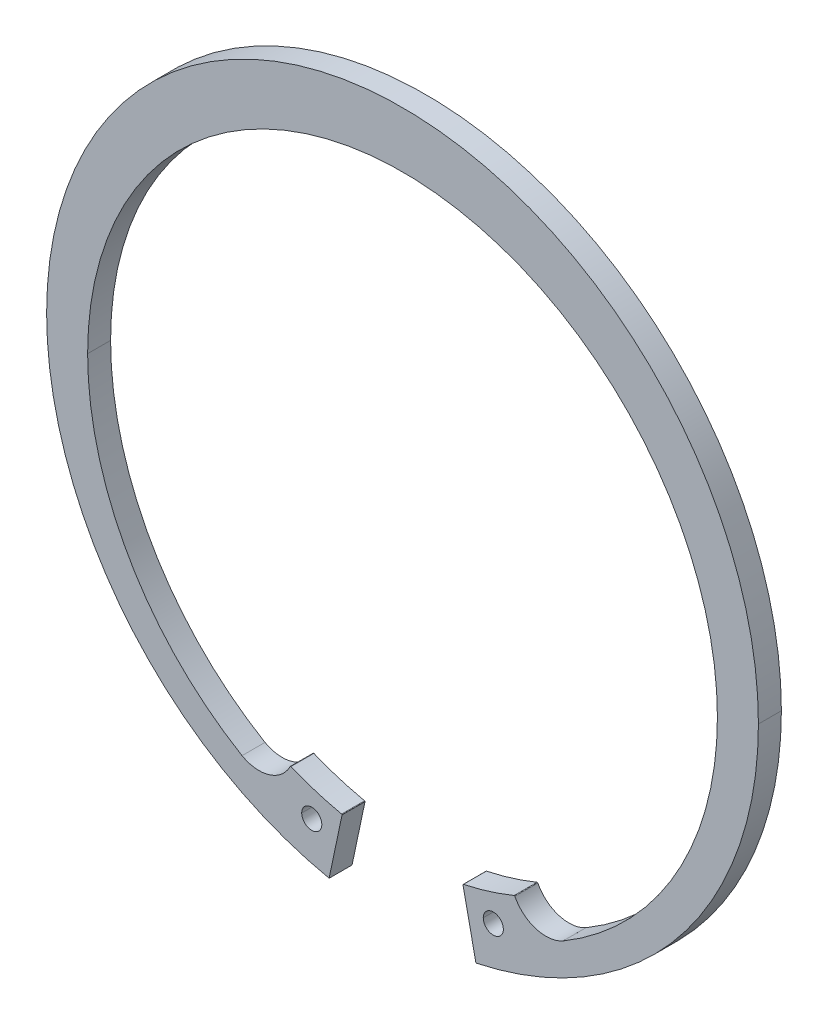
ISO-10303-21;
HEADER;
FILE_DESCRIPTION(('STEP AP214'),'2;1');
FILE_NAME('part.step','',(''),(''),'','','');
FILE_SCHEMA(('AUTOMOTIVE_DESIGN { 1 0 10303 214 1 1 1 1 }'));
ENDSEC;
DATA;
#1=APPLICATION_CONTEXT('core data for automotive mechanical design processes');
#2=APPLICATION_PROTOCOL_DEFINITION('international standard','automotive_design',2000,#1);
#3=PRODUCT_CONTEXT('',#1,'mechanical');
#4=PRODUCT('Part','Part','',(#3));
#5=PRODUCT_RELATED_PRODUCT_CATEGORY('part','',(#4));
#6=PRODUCT_DEFINITION_FORMATION('','',#4);
#7=PRODUCT_DEFINITION_CONTEXT('part definition',#1,'design');
#8=PRODUCT_DEFINITION('design','',#6,#7);
#9=PRODUCT_DEFINITION_SHAPE('','',#8);
#10=(LENGTH_UNIT() NAMED_UNIT(*) SI_UNIT(.MILLI.,.METRE.));
#11=(NAMED_UNIT(*) PLANE_ANGLE_UNIT() SI_UNIT($,.RADIAN.));
#12=(NAMED_UNIT(*) SI_UNIT($,.STERADIAN.) SOLID_ANGLE_UNIT());
#13=UNCERTAINTY_MEASURE_WITH_UNIT(LENGTH_MEASURE(1.E-05),#10,'distance_accuracy_value','');
#14=(GEOMETRIC_REPRESENTATION_CONTEXT(3) GLOBAL_UNCERTAINTY_ASSIGNED_CONTEXT((#13)) GLOBAL_UNIT_ASSIGNED_CONTEXT((#10,
#11,#12)) REPRESENTATION_CONTEXT('',''));
#15=CARTESIAN_POINT('',(0.,0.,0.));
#16=DIRECTION('',(0.,0.,1.));
#17=DIRECTION('',(1.,0.,0.));
#18=AXIS2_PLACEMENT_3D('',#15,#16,#17);
#19=CARTESIAN_POINT('',(-10.6376785615645,-49.9804941434239,-4.));
#20=DIRECTION('',(0.,0.,1.));
#21=DIRECTION('',(1.,0.,0.));
#22=AXIS2_PLACEMENT_3D('',#19,#20,#21);
#23=CYLINDRICAL_SURFACE('',#22,0.100000000000006);
#24=DIRECTION('',(0.,0.,1.));
#25=VECTOR('',#24,1.);
#26=CARTESIAN_POINT('',(-10.5376785615645,-49.9804941434239,-4.));
#27=LINE('',#26,#25);
#28=CARTESIAN_POINT('',(-10.5376785615645,-49.9804941434239,-4.));
#29=VERTEX_POINT('',#28);
#30=CARTESIAN_POINT('',(-10.5376785615645,-49.9804941434239,0.));
#31=VERTEX_POINT('',#30);
#32=EDGE_CURVE('E215',#29,#31,#27,.T.);
#33=ORIENTED_EDGE('',*,*,#32,.F.);
#34=CARTESIAN_POINT('',(-10.6376785615645,-49.9804941434239,-4.));
#35=DIRECTION('',(0.,0.,1.));
#36=DIRECTION('',(-1.,0.,0.));
#37=AXIS2_PLACEMENT_3D('',#34,#35,#36);
#38=CIRCLE('',#37,0.100000000000006);
#39=CARTESIAN_POINT('',(-10.6168611866887,-49.8826849572332,-4.));
#40=VERTEX_POINT('',#39);
#41=EDGE_CURVE('E342',#29,#40,#38,.T.);
#42=ORIENTED_EDGE('',*,*,#41,.T.);
#43=DIRECTION('',(0.,0.,1.));
#44=VECTOR('',#43,1.);
#45=CARTESIAN_POINT('',(-10.6168611866887,-49.8826849572332,-4.));
#46=LINE('',#45,#44);
#47=CARTESIAN_POINT('',(-10.6168611866887,-49.8826849572332,0.));
#48=VERTEX_POINT('',#47);
#49=EDGE_CURVE('E217',#40,#48,#46,.T.);
#50=ORIENTED_EDGE('',*,*,#49,.T.);
#51=CARTESIAN_POINT('',(-10.6376785615645,-49.9804941434239,0.));
#52=DIRECTION('',(0.,0.,1.));
#53=DIRECTION('',(-1.,0.,0.));
#54=AXIS2_PLACEMENT_3D('',#51,#52,#53);
#55=CIRCLE('',#54,0.100000000000006);
#56=EDGE_CURVE('E211',#31,#48,#55,.T.);
#57=ORIENTED_EDGE('',*,*,#56,.F.);
#58=EDGE_LOOP('',(#33,#42,#50,#57));
#59=FACE_BOUND('',#58,.T.);
#60=ADVANCED_FACE('F17',(#59),#23,.T.);
#61=CARTESIAN_POINT('',(-19.4788205407317,-47.2417775950691,-4.));
#62=DIRECTION('',(0.,0.,1.));
#63=DIRECTION('',(1.,0.,0.));
#64=AXIS2_PLACEMENT_3D('',#61,#62,#63);
#65=CYLINDRICAL_SURFACE('',#64,0.100000000000006);
#66=CARTESIAN_POINT('',(-19.4788205407317,-47.2417775950691,0.));
#67=DIRECTION('',(0.,0.,1.));
#68=DIRECTION('',(1.,0.,0.));
#69=AXIS2_PLACEMENT_3D('',#66,#67,#68);
#70=CIRCLE('',#69,0.100000000000006);
#71=CARTESIAN_POINT('',(-19.440701518147,-47.1493279324564,0.));
#72=VERTEX_POINT('',#71);
#73=CARTESIAN_POINT('',(-19.5680808134692,-47.1966931885541,0.));
#74=VERTEX_POINT('',#73);
#75=EDGE_CURVE('E432',#72,#74,#70,.T.);
#76=ORIENTED_EDGE('',*,*,#75,.F.);
#77=DIRECTION('',(0.,0.,1.));
#78=VECTOR('',#77,1.);
#79=CARTESIAN_POINT('',(-19.440701518147,-47.1493279324564,-4.));
#80=LINE('',#79,#78);
#81=CARTESIAN_POINT('',(-19.440701518147,-47.1493279324564,-4.));
#82=VERTEX_POINT('',#81);
#83=EDGE_CURVE('E369',#82,#72,#80,.T.);
#84=ORIENTED_EDGE('',*,*,#83,.F.);
#85=CARTESIAN_POINT('',(-19.4788205407317,-47.2417775950691,-4.));
#86=DIRECTION('',(0.,0.,1.));
#87=DIRECTION('',(1.,0.,0.));
#88=AXIS2_PLACEMENT_3D('',#85,#86,#87);
#89=CIRCLE('',#88,0.100000000000006);
#90=CARTESIAN_POINT('',(-19.5680808134692,-47.1966931885541,-4.));
#91=VERTEX_POINT('',#90);
#92=EDGE_CURVE('E322',#82,#91,#89,.T.);
#93=ORIENTED_EDGE('',*,*,#92,.T.);
#94=DIRECTION('',(0.,0.,1.));
#95=VECTOR('',#94,1.);
#96=CARTESIAN_POINT('',(-19.5680808134692,-47.1966931885541,-4.));
#97=LINE('',#96,#95);
#98=EDGE_CURVE('E11',#91,#74,#97,.T.);
#99=ORIENTED_EDGE('',*,*,#98,.T.);
#100=EDGE_LOOP('',(#76,#84,#93,#99));
#101=FACE_BOUND('',#100,.T.);
#102=ADVANCED_FACE('F490',(#101),#65,.T.);
#103=CARTESIAN_POINT('',(-24.9848036662416,-44.4607645656186,-4.));
#104=DIRECTION('',(0.,0.,1.));
#105=DIRECTION('',(1.,0.,0.));
#106=AXIS2_PLACEMENT_3D('',#103,#104,#105);
#107=CYLINDRICAL_SURFACE('',#106,6.06845877414888);
#108=CARTESIAN_POINT('',(-24.9848036662416,-44.4607645656186,0.));
#109=DIRECTION('',(0.,0.,-1.));
#110=DIRECTION('',(1.,0.,0.));
#111=AXIS2_PLACEMENT_3D('',#108,#109,#110);
#112=CIRCLE('',#111,6.06845877414888);
#113=CARTESIAN_POINT('',(-27.9577301570023,-49.7511237192184,0.));
#114=VERTEX_POINT('',#113);
#115=EDGE_CURVE('E21',#74,#114,#112,.T.);
#116=ORIENTED_EDGE('',*,*,#115,.F.);
#117=ORIENTED_EDGE('',*,*,#98,.F.);
#118=CARTESIAN_POINT('',(-24.9848036662416,-44.4607645656186,-4.));
#119=DIRECTION('',(0.,0.,-1.));
#120=DIRECTION('',(1.,0.,0.));
#121=AXIS2_PLACEMENT_3D('',#118,#119,#120);
#122=CIRCLE('',#121,6.06845877414888);
#123=CARTESIAN_POINT('',(-27.9577301570023,-49.7511237192184,-4.));
#124=VERTEX_POINT('',#123);
#125=EDGE_CURVE('E253',#91,#124,#122,.T.);
#126=ORIENTED_EDGE('',*,*,#125,.T.);
#127=DIRECTION('',(0.,0.,1.));
#128=VECTOR('',#127,1.);
#129=CARTESIAN_POINT('',(-27.9577301570023,-49.7511237192184,-4.));
#130=LINE('',#129,#128);
#131=EDGE_CURVE('E28',#124,#114,#130,.T.);
#132=ORIENTED_EDGE('',*,*,#131,.T.);
#133=EDGE_LOOP('',(#116,#117,#126,#132));
#134=FACE_BOUND('',#133,.T.);
#135=ADVANCED_FACE('F870',(#134),#107,.F.);
#136=CARTESIAN_POINT('',(-30.3736828883721,-54.0503412366343,-4.));
#137=DIRECTION('',(-0.871779697365069,0.489898111102777,0.));
#138=DIRECTION('',(0.,0.,1.));
#139=AXIS2_PLACEMENT_3D('',#136,#137,#138);
#140=PLANE('',#139);
#141=DIRECTION('',(-0.489898111102777,-0.871779697365069,0.));
#142=VECTOR('',#141,1.);
#143=CARTESIAN_POINT('',(-30.3736828883721,-54.0503412366343,-4.));
#144=LINE('',#143,#142);
#145=CARTESIAN_POINT('',(-27.9586015048703,-49.7526742934368,-4.));
#146=VERTEX_POINT('',#145);
#147=EDGE_CURVE('E250',#124,#146,#144,.T.);
#148=ORIENTED_EDGE('',*,*,#147,.T.);
#149=DIRECTION('',(0.,0.,1.));
#150=VECTOR('',#149,1.);
#151=CARTESIAN_POINT('',(-27.9586015048703,-49.7526742934368,-4.));
#152=LINE('',#151,#150);
#153=CARTESIAN_POINT('',(-27.9586015048703,-49.7526742934368,0.));
#154=VERTEX_POINT('',#153);
#155=EDGE_CURVE('E309',#146,#154,#152,.T.);
#156=ORIENTED_EDGE('',*,*,#155,.T.);
#157=DIRECTION('',(-0.489898111102777,-0.871779697365069,0.));
#158=VECTOR('',#157,1.);
#159=CARTESIAN_POINT('',(-30.3736828883721,-54.0503412366343,0.));
#160=LINE('',#159,#158);
#161=EDGE_CURVE('E397',#114,#154,#160,.T.);
#162=ORIENTED_EDGE('',*,*,#161,.F.);
#163=ORIENTED_EDGE('',*,*,#131,.F.);
#164=EDGE_LOOP('',(#148,#156,#162,#163));
#165=FACE_BOUND('',#164,.T.);
#166=ADVANCED_FACE('F496',(#165),#140,.T.);
#167=CARTESIAN_POINT('',(0.,0.,-4.));
#168=DIRECTION('',(0.,0.,1.));
#169=DIRECTION('',(1.,0.,0.));
#170=AXIS2_PLACEMENT_3D('',#167,#168,#169);
#171=CYLINDRICAL_SURFACE('',#170,51.);
#172=CARTESIAN_POINT('',(0.,0.,0.));
#173=DIRECTION('',(0.,0.,-1.));
#174=DIRECTION('',(1.,0.,0.));
#175=AXIS2_PLACEMENT_3D('',#172,#173,#174);
#176=CIRCLE('',#175,51.);
#177=EDGE_CURVE('E222',#48,#72,#176,.T.);
#178=ORIENTED_EDGE('',*,*,#177,.F.);
#179=ORIENTED_EDGE('',*,*,#49,.F.);
#180=CARTESIAN_POINT('',(0.,0.,-4.));
#181=DIRECTION('',(0.,0.,-1.));
#182=DIRECTION('',(1.,0.,0.));
#183=AXIS2_PLACEMENT_3D('',#180,#181,#182);
#184=CIRCLE('',#183,51.);
#185=EDGE_CURVE('E379',#40,#82,#184,.T.);
#186=ORIENTED_EDGE('',*,*,#185,.T.);
#187=ORIENTED_EDGE('',*,*,#83,.T.);
#188=EDGE_LOOP('',(#178,#179,#186,#187));
#189=FACE_BOUND('',#188,.T.);
#190=ADVANCED_FACE('F487',(#189),#171,.F.);
#191=CARTESIAN_POINT('',(27.9577301570023,-49.7511237192185,-4.));
#192=DIRECTION('',(0.871779697365069,0.489898111102777,0.));
#193=DIRECTION('',(0.,0.,-1.));
#194=AXIS2_PLACEMENT_3D('',#191,#192,#193);
#195=PLANE('',#194);
#196=DIRECTION('',(-0.489898111102777,0.871779697365069,0.));
#197=VECTOR('',#196,1.);
#198=CARTESIAN_POINT('',(27.9577301570023,-49.7511237192185,0.));
#199=LINE('',#198,#197);
#200=CARTESIAN_POINT('',(27.9586015048703,-49.7526742934368,0.));
#201=VERTEX_POINT('',#200);
#202=CARTESIAN_POINT('',(27.9577301570022,-49.7511237192185,0.));
#203=VERTEX_POINT('',#202);
#204=EDGE_CURVE('E400',#201,#203,#199,.T.);
#205=ORIENTED_EDGE('',*,*,#204,.F.);
#206=DIRECTION('',(0.,0.,-1.));
#207=VECTOR('',#206,1.);
#208=CARTESIAN_POINT('',(27.9586015048703,-49.7526742934368,-4.));
#209=LINE('',#208,#207);
#210=CARTESIAN_POINT('',(27.9586015048703,-49.7526742934368,-4.));
#211=VERTEX_POINT('',#210);
#212=EDGE_CURVE('E279',#201,#211,#209,.T.);
#213=ORIENTED_EDGE('',*,*,#212,.T.);
#214=DIRECTION('',(-0.489898111102777,0.871779697365069,0.));
#215=VECTOR('',#214,1.);
#216=CARTESIAN_POINT('',(27.9577301570023,-49.7511237192185,-4.));
#217=LINE('',#216,#215);
#218=CARTESIAN_POINT('',(27.9577301570022,-49.7511237192185,-4.));
#219=VERTEX_POINT('',#218);
#220=EDGE_CURVE('E442',#211,#219,#217,.T.);
#221=ORIENTED_EDGE('',*,*,#220,.T.);
#222=DIRECTION('',(0.,0.,1.));
#223=VECTOR('',#222,1.);
#224=CARTESIAN_POINT('',(27.9577301570022,-49.7511237192185,-4.));
#225=LINE('',#224,#223);
#226=EDGE_CURVE('E307',#219,#203,#225,.T.);
#227=ORIENTED_EDGE('',*,*,#226,.T.);
#228=EDGE_LOOP('',(#205,#213,#221,#227));
#229=FACE_BOUND('',#228,.T.);
#230=ADVANCED_FACE('F511',(#229),#195,.T.);
#231=CARTESIAN_POINT('',(24.9848036662416,-44.4607645656186,-4.));
#232=DIRECTION('',(0.,0.,1.));
#233=DIRECTION('',(1.,0.,0.));
#234=AXIS2_PLACEMENT_3D('',#231,#232,#233);
#235=CYLINDRICAL_SURFACE('',#234,6.06845877414888);
#236=CARTESIAN_POINT('',(24.9848036662416,-44.4607645656186,0.));
#237=DIRECTION('',(0.,0.,-1.));
#238=DIRECTION('',(1.,0.,0.));
#239=AXIS2_PLACEMENT_3D('',#236,#237,#238);
#240=CIRCLE('',#239,6.06845877414888);
#241=CARTESIAN_POINT('',(19.5680808134692,-47.1966931885541,0.));
#242=VERTEX_POINT('',#241);
#243=EDGE_CURVE('E294',#203,#242,#240,.T.);
#244=ORIENTED_EDGE('',*,*,#243,.F.);
#245=ORIENTED_EDGE('',*,*,#226,.F.);
#246=CARTESIAN_POINT('',(24.9848036662416,-44.4607645656186,-4.));
#247=DIRECTION('',(0.,0.,-1.));
#248=DIRECTION('',(1.,0.,0.));
#249=AXIS2_PLACEMENT_3D('',#246,#247,#248);
#250=CIRCLE('',#249,6.06845877414888);
#251=CARTESIAN_POINT('',(19.5680808134692,-47.1966931885541,-4.));
#252=VERTEX_POINT('',#251);
#253=EDGE_CURVE('E383',#219,#252,#250,.T.);
#254=ORIENTED_EDGE('',*,*,#253,.T.);
#255=DIRECTION('',(0.,0.,1.));
#256=VECTOR('',#255,1.);
#257=CARTESIAN_POINT('',(19.5680808134692,-47.1966931885541,-4.));
#258=LINE('',#257,#256);
#259=EDGE_CURVE('E303',#252,#242,#258,.T.);
#260=ORIENTED_EDGE('',*,*,#259,.T.);
#261=EDGE_LOOP('',(#244,#245,#254,#260));
#262=FACE_BOUND('',#261,.T.);
#263=ADVANCED_FACE('F19',(#262),#235,.F.);
#264=CARTESIAN_POINT('',(19.4788205407317,-47.2417775950691,-4.));
#265=DIRECTION('',(0.,0.,1.));
#266=DIRECTION('',(1.,0.,0.));
#267=AXIS2_PLACEMENT_3D('',#264,#265,#266);
#268=CYLINDRICAL_SURFACE('',#267,0.100000000000006);
#269=CARTESIAN_POINT('',(19.4788205407317,-47.2417775950691,0.));
#270=DIRECTION('',(0.,0.,1.));
#271=DIRECTION('',(-1.,0.,0.));
#272=AXIS2_PLACEMENT_3D('',#269,#270,#271);
#273=CIRCLE('',#272,0.100000000000006);
#274=CARTESIAN_POINT('',(19.440701518147,-47.1493279324564,0.));
#275=VERTEX_POINT('',#274);
#276=EDGE_CURVE('E365',#242,#275,#273,.T.);
#277=ORIENTED_EDGE('',*,*,#276,.F.);
#278=ORIENTED_EDGE('',*,*,#259,.F.);
#279=CARTESIAN_POINT('',(19.4788205407317,-47.2417775950691,-4.));
#280=DIRECTION('',(0.,0.,1.));
#281=DIRECTION('',(-1.,0.,0.));
#282=AXIS2_PLACEMENT_3D('',#279,#280,#281);
#283=CIRCLE('',#282,0.100000000000006);
#284=CARTESIAN_POINT('',(19.440701518147,-47.1493279324564,-4.));
#285=VERTEX_POINT('',#284);
#286=EDGE_CURVE('E346',#252,#285,#283,.T.);
#287=ORIENTED_EDGE('',*,*,#286,.T.);
#288=DIRECTION('',(0.,0.,1.));
#289=VECTOR('',#288,1.);
#290=CARTESIAN_POINT('',(19.440701518147,-47.1493279324564,-4.));
#291=LINE('',#290,#289);
#292=EDGE_CURVE('E393',#285,#275,#291,.T.);
#293=ORIENTED_EDGE('',*,*,#292,.T.);
#294=EDGE_LOOP('',(#277,#278,#287,#293));
#295=FACE_BOUND('',#294,.T.);
#296=ADVANCED_FACE('F958',(#295),#268,.T.);
#297=CARTESIAN_POINT('',(10.6376785615645,-49.9804941434239,-4.));
#298=DIRECTION('',(0.,0.,1.));
#299=DIRECTION('',(1.,0.,0.));
#300=AXIS2_PLACEMENT_3D('',#297,#298,#299);
#301=CYLINDRICAL_SURFACE('',#300,0.100000000000005);
#302=CARTESIAN_POINT('',(10.6376785615645,-49.9804941434239,0.));
#303=DIRECTION('',(0.,0.,1.));
#304=DIRECTION('',(1.,0.,0.));
#305=AXIS2_PLACEMENT_3D('',#302,#303,#304);
#306=CIRCLE('',#305,0.100000000000005);
#307=CARTESIAN_POINT('',(10.6168611866887,-49.8826849572332,0.));
#308=VERTEX_POINT('',#307);
#309=CARTESIAN_POINT('',(10.5398288241585,-50.0011200710288,0.));
#310=VERTEX_POINT('',#309);
#311=EDGE_CURVE('E223',#308,#310,#306,.T.);
#312=ORIENTED_EDGE('',*,*,#311,.F.);
#313=DIRECTION('',(0.,0.,1.));
#314=VECTOR('',#313,1.);
#315=CARTESIAN_POINT('',(10.6168611866887,-49.8826849572332,-4.));
#316=LINE('',#315,#314);
#317=CARTESIAN_POINT('',(10.6168611866887,-49.8826849572332,-4.));
#318=VERTEX_POINT('',#317);
#319=EDGE_CURVE('E308',#318,#308,#316,.T.);
#320=ORIENTED_EDGE('',*,*,#319,.F.);
#321=CARTESIAN_POINT('',(10.6376785615645,-49.9804941434239,-4.));
#322=DIRECTION('',(0.,0.,1.));
#323=DIRECTION('',(1.,0.,0.));
#324=AXIS2_PLACEMENT_3D('',#321,#322,#323);
#325=CIRCLE('',#324,0.100000000000005);
#326=CARTESIAN_POINT('',(10.5398288241585,-50.0011200710288,-4.));
#327=VERTEX_POINT('',#326);
#328=EDGE_CURVE('E338',#318,#327,#325,.T.);
#329=ORIENTED_EDGE('',*,*,#328,.T.);
#330=DIRECTION('',(0.,0.,1.));
#331=VECTOR('',#330,1.);
#332=CARTESIAN_POINT('',(10.5398288241585,-50.0011200710288,-4.));
#333=LINE('',#332,#331);
#334=EDGE_CURVE('E268',#327,#310,#333,.T.);
#335=ORIENTED_EDGE('',*,*,#334,.T.);
#336=EDGE_LOOP('',(#312,#320,#329,#335));
#337=FACE_BOUND('',#336,.T.);
#338=ADVANCED_FACE('F962',(#337),#301,.T.);
#339=CARTESIAN_POINT('',(0.,0.,-4.));
#340=DIRECTION('',(0.,0.,1.));
#341=DIRECTION('',(1.,0.,0.));
#342=AXIS2_PLACEMENT_3D('',#339,#340,#341);
#343=CYLINDRICAL_SURFACE('',#342,51.);
#344=CARTESIAN_POINT('',(0.,0.,0.));
#345=DIRECTION('',(0.,0.,-1.));
#346=DIRECTION('',(1.,0.,0.));
#347=AXIS2_PLACEMENT_3D('',#344,#345,#346);
#348=CIRCLE('',#347,51.);
#349=EDGE_CURVE('E337',#275,#308,#348,.T.);
#350=ORIENTED_EDGE('',*,*,#349,.F.);
#351=ORIENTED_EDGE('',*,*,#292,.F.);
#352=CARTESIAN_POINT('',(0.,0.,-4.));
#353=DIRECTION('',(0.,0.,-1.));
#354=DIRECTION('',(1.,0.,0.));
#355=AXIS2_PLACEMENT_3D('',#352,#353,#354);
#356=CIRCLE('',#355,51.);
#357=EDGE_CURVE('E341',#285,#318,#356,.T.);
#358=ORIENTED_EDGE('',*,*,#357,.T.);
#359=ORIENTED_EDGE('',*,*,#319,.T.);
#360=EDGE_LOOP('',(#350,#351,#358,#359));
#361=FACE_BOUND('',#360,.T.);
#362=ADVANCED_FACE('F978',(#361),#343,.F.);
#363=CARTESIAN_POINT('',(-15.8129375748492,-53.1996335067632,-4.));
#364=DIRECTION('',(0.,0.,1.));
#365=DIRECTION('',(1.,0.,0.));
#366=AXIS2_PLACEMENT_3D('',#363,#364,#365);
#367=CYLINDRICAL_SURFACE('',#366,1.75);
#368=DIRECTION('',(0.,0.,1.));
#369=VECTOR('',#368,1.);
#370=CARTESIAN_POINT('',(-17.5629375748492,-53.1996335067632,-4.));
#371=LINE('',#370,#369);
#372=CARTESIAN_POINT('',(-17.5629375748492,-53.1996335067632,-4.));
#373=VERTEX_POINT('',#372);
#374=CARTESIAN_POINT('',(-17.5629375748492,-53.1996335067632,0.));
#375=VERTEX_POINT('',#374);
#376=EDGE_CURVE('E387',#373,#375,#371,.T.);
#377=ORIENTED_EDGE('',*,*,#376,.F.);
#378=CARTESIAN_POINT('',(-15.8129375748492,-53.1996335067632,-4.));
#379=DIRECTION('',(0.,0.,1.));
#380=DIRECTION('',(1.,0.,0.));
#381=AXIS2_PLACEMENT_3D('',#378,#379,#380);
#382=CIRCLE('',#381,1.75);
#383=CARTESIAN_POINT('',(-14.0629375748492,-53.1996335067632,-4.));
#384=VERTEX_POINT('',#383);
#385=EDGE_CURVE('E401',#384,#373,#382,.T.);
#386=ORIENTED_EDGE('',*,*,#385,.F.);
#387=DIRECTION('',(0.,0.,1.));
#388=VECTOR('',#387,1.);
#389=CARTESIAN_POINT('',(-14.0629375748492,-53.1996335067632,-4.));
#390=LINE('',#389,#388);
#391=CARTESIAN_POINT('',(-14.0629375748492,-53.1996335067632,0.));
#392=VERTEX_POINT('',#391);
#393=EDGE_CURVE('E416',#384,#392,#390,.T.);
#394=ORIENTED_EDGE('',*,*,#393,.T.);
#395=CARTESIAN_POINT('',(-15.8129375748492,-53.1996335067632,0.));
#396=DIRECTION('',(0.,0.,1.));
#397=DIRECTION('',(1.,0.,0.));
#398=AXIS2_PLACEMENT_3D('',#395,#396,#397);
#399=CIRCLE('',#398,1.75);
#400=EDGE_CURVE('E350',#392,#375,#399,.T.);
#401=ORIENTED_EDGE('',*,*,#400,.T.);
#402=EDGE_LOOP('',(#377,#386,#394,#401));
#403=FACE_BOUND('',#402,.T.);
#404=ADVANCED_FACE('F864',(#403),#367,.F.);
#405=CARTESIAN_POINT('',(15.8129375748492,-53.1996335067632,-4.));
#406=DIRECTION('',(0.,0.,1.));
#407=DIRECTION('',(1.,0.,0.));
#408=AXIS2_PLACEMENT_3D('',#405,#406,#407);
#409=CYLINDRICAL_SURFACE('',#408,1.75);
#410=DIRECTION('',(0.,0.,1.));
#411=VECTOR('',#410,1.);
#412=CARTESIAN_POINT('',(14.0629375748492,-53.1996335067632,-4.));
#413=LINE('',#412,#411);
#414=CARTESIAN_POINT('',(14.0629375748492,-53.1996335067632,-4.));
#415=VERTEX_POINT('',#414);
#416=CARTESIAN_POINT('',(14.0629375748492,-53.1996335067632,0.));
#417=VERTEX_POINT('',#416);
#418=EDGE_CURVE('E351',#415,#417,#413,.T.);
#419=ORIENTED_EDGE('',*,*,#418,.F.);
#420=CARTESIAN_POINT('',(15.8129375748492,-53.1996335067632,-4.));
#421=DIRECTION('',(0.,0.,1.));
#422=DIRECTION('',(1.,0.,0.));
#423=AXIS2_PLACEMENT_3D('',#420,#421,#422);
#424=CIRCLE('',#423,1.75);
#425=CARTESIAN_POINT('',(17.5629375748492,-53.1996335067632,-4.));
#426=VERTEX_POINT('',#425);
#427=EDGE_CURVE('E454',#426,#415,#424,.T.);
#428=ORIENTED_EDGE('',*,*,#427,.F.);
#429=DIRECTION('',(0.,0.,1.));
#430=VECTOR('',#429,1.);
#431=CARTESIAN_POINT('',(17.5629375748492,-53.1996335067632,-4.));
#432=LINE('',#431,#430);
#433=CARTESIAN_POINT('',(17.5629375748492,-53.1996335067632,0.));
#434=VERTEX_POINT('',#433);
#435=EDGE_CURVE('E326',#426,#434,#432,.T.);
#436=ORIENTED_EDGE('',*,*,#435,.T.);
#437=CARTESIAN_POINT('',(15.8129375748492,-53.1996335067632,0.));
#438=DIRECTION('',(0.,0.,1.));
#439=DIRECTION('',(1.,0.,0.));
#440=AXIS2_PLACEMENT_3D('',#437,#438,#439);
#441=CIRCLE('',#440,1.75);
#442=EDGE_CURVE('E347',#434,#417,#441,.T.);
#443=ORIENTED_EDGE('',*,*,#442,.T.);
#444=EDGE_LOOP('',(#419,#428,#436,#443));
#445=FACE_BOUND('',#444,.T.);
#446=ADVANCED_FACE('F860',(#445),#409,.F.);
#447=CARTESIAN_POINT('',(0.,0.,0.));
#448=DIRECTION('',(0.,0.,1.));
#449=DIRECTION('',(1.,0.,0.));
#450=AXIS2_PLACEMENT_3D('',#447,#448,#449);
#451=PLANE('',#450);
#452=ORIENTED_EDGE('',*,*,#400,.F.);
#453=CARTESIAN_POINT('',(-15.8129375748492,-53.1996335067632,0.));
#454=DIRECTION('',(0.,0.,1.));
#455=DIRECTION('',(1.,0.,0.));
#456=AXIS2_PLACEMENT_3D('',#453,#454,#455);
#457=CIRCLE('',#456,1.75);
#458=EDGE_CURVE('E423',#375,#392,#457,.T.);
#459=ORIENTED_EDGE('',*,*,#458,.F.);
#460=EDGE_LOOP('',(#452,#459));
#461=FACE_BOUND('',#460,.T.);
#462=ORIENTED_EDGE('',*,*,#442,.F.);
#463=CARTESIAN_POINT('',(15.8129375748492,-53.1996335067632,0.));
#464=DIRECTION('',(0.,0.,1.));
#465=DIRECTION('',(1.,0.,0.));
#466=AXIS2_PLACEMENT_3D('',#463,#464,#465);
#467=CIRCLE('',#466,1.75);
#468=EDGE_CURVE('E330',#417,#434,#467,.T.);
#469=ORIENTED_EDGE('',*,*,#468,.F.);
#470=EDGE_LOOP('',(#462,#469));
#471=FACE_BOUND('',#470,.T.);
#472=ORIENTED_EDGE('',*,*,#161,.T.);
#473=CARTESIAN_POINT('',(0.,-2.55614074334208,0.));
#474=DIRECTION('',(0.,0.,-1.));
#475=DIRECTION('',(1.,0.,0.));
#476=AXIS2_PLACEMENT_3D('',#473,#474,#475);
#477=CIRCLE('',#476,54.8561407433421);
#478=CARTESIAN_POINT('',(-54.8561407433421,-2.55614074334207,0.));
#479=VERTEX_POINT('',#478);
#480=EDGE_CURVE('E314',#154,#479,#477,.T.);
#481=ORIENTED_EDGE('',*,*,#480,.T.);
#482=CARTESIAN_POINT('',(0.,-2.55614074334208,0.));
#483=DIRECTION('',(0.,0.,-1.));
#484=DIRECTION('',(1.,0.,0.));
#485=AXIS2_PLACEMENT_3D('',#482,#483,#484);
#486=CIRCLE('',#485,54.8561407433421);
#487=CARTESIAN_POINT('',(54.8561407433421,-2.55614074334208,0.));
#488=VERTEX_POINT('',#487);
#489=EDGE_CURVE('E260',#479,#488,#486,.T.);
#490=ORIENTED_EDGE('',*,*,#489,.T.);
#491=CARTESIAN_POINT('',(0.,-2.55614074334208,0.));
#492=DIRECTION('',(0.,0.,-1.));
#493=DIRECTION('',(1.,0.,0.));
#494=AXIS2_PLACEMENT_3D('',#491,#492,#493);
#495=CIRCLE('',#494,54.8561407433421);
#496=EDGE_CURVE('E362',#488,#201,#495,.T.);
#497=ORIENTED_EDGE('',*,*,#496,.T.);
#498=ORIENTED_EDGE('',*,*,#204,.T.);
#499=ORIENTED_EDGE('',*,*,#243,.T.);
#500=ORIENTED_EDGE('',*,*,#276,.T.);
#501=ORIENTED_EDGE('',*,*,#349,.T.);
#502=ORIENTED_EDGE('',*,*,#311,.T.);
#503=DIRECTION('',(0.206259276048984,-0.978497374060733,0.));
#504=VECTOR('',#503,1.);
#505=CARTESIAN_POINT('',(12.788075115037,-60.6668371917654,0.));
#506=LINE('',#505,#504);
#507=CARTESIAN_POINT('',(12.788075115037,-60.6668371917654,0.));
#508=VERTEX_POINT('',#507);
#509=EDGE_CURVE('E282',#310,#508,#506,.T.);
#510=ORIENTED_EDGE('',*,*,#509,.T.);
#511=CARTESIAN_POINT('',(0.,0.,0.));
#512=DIRECTION('',(0.,0.,1.));
#513=DIRECTION('',(1.,0.,0.));
#514=AXIS2_PLACEMENT_3D('',#511,#512,#513);
#515=CIRCLE('',#514,62.);
#516=CARTESIAN_POINT('',(62.,0.,0.));
#517=VERTEX_POINT('',#516);
#518=EDGE_CURVE('E263',#508,#517,#515,.T.);
#519=ORIENTED_EDGE('',*,*,#518,.T.);
#520=CARTESIAN_POINT('',(0.,0.,0.));
#521=DIRECTION('',(0.,0.,1.));
#522=DIRECTION('',(1.,0.,0.));
#523=AXIS2_PLACEMENT_3D('',#520,#521,#522);
#524=CIRCLE('',#523,62.);
#525=CARTESIAN_POINT('',(-62.,0.,0.));
#526=VERTEX_POINT('',#525);
#527=EDGE_CURVE('E315',#517,#526,#524,.T.);
#528=ORIENTED_EDGE('',*,*,#527,.T.);
#529=CARTESIAN_POINT('',(0.,0.,0.));
#530=DIRECTION('',(0.,0.,1.));
#531=DIRECTION('',(1.,0.,0.));
#532=AXIS2_PLACEMENT_3D('',#529,#530,#531);
#533=CIRCLE('',#532,62.);
#534=CARTESIAN_POINT('',(-12.788075115037,-60.6668371917654,0.));
#535=VERTEX_POINT('',#534);
#536=EDGE_CURVE('E290',#526,#535,#533,.T.);
#537=ORIENTED_EDGE('',*,*,#536,.T.);
#538=DIRECTION('',(0.206259276048984,0.978497374060733,0.));
#539=VECTOR('',#538,1.);
#540=CARTESIAN_POINT('',(-12.788075115037,-60.6668371917654,0.));
#541=LINE('',#540,#539);
#542=CARTESIAN_POINT('',(-10.5398288241585,-50.0011200710288,0.));
#543=VERTEX_POINT('',#542);
#544=EDGE_CURVE('E229',#535,#543,#541,.T.);
#545=ORIENTED_EDGE('',*,*,#544,.T.);
#546=CARTESIAN_POINT('',(-10.6376785615645,-49.9804941434239,0.));
#547=DIRECTION('',(0.,0.,1.));
#548=DIRECTION('',(-1.,0.,0.));
#549=AXIS2_PLACEMENT_3D('',#546,#547,#548);
#550=CIRCLE('',#549,0.100000000000006);
#551=EDGE_CURVE('E226',#543,#31,#550,.T.);
#552=ORIENTED_EDGE('',*,*,#551,.T.);
#553=ORIENTED_EDGE('',*,*,#56,.T.);
#554=ORIENTED_EDGE('',*,*,#177,.T.);
#555=ORIENTED_EDGE('',*,*,#75,.T.);
#556=ORIENTED_EDGE('',*,*,#115,.T.);
#557=EDGE_LOOP('',(#472,#481,#490,#497,#498,#499,#500,#501,#502,#510,#519,#528,#537,#545,#552,
#553,#554,#555,#556));
#558=FACE_BOUND('',#557,.T.);
#559=ADVANCED_FACE('F227',(#461,#471,#558),#451,.T.);
#560=CARTESIAN_POINT('',(0.,0.,-4.));
#561=DIRECTION('',(0.,0.,1.));
#562=DIRECTION('',(1.,0.,0.));
#563=AXIS2_PLACEMENT_3D('',#560,#561,#562);
#564=PLANE('',#563);
#565=ORIENTED_EDGE('',*,*,#385,.T.);
#566=CARTESIAN_POINT('',(-15.8129375748492,-53.1996335067632,-4.));
#567=DIRECTION('',(0.,0.,1.));
#568=DIRECTION('',(1.,0.,0.));
#569=AXIS2_PLACEMENT_3D('',#566,#567,#568);
#570=CIRCLE('',#569,1.75);
#571=EDGE_CURVE('E301',#373,#384,#570,.T.);
#572=ORIENTED_EDGE('',*,*,#571,.T.);
#573=EDGE_LOOP('',(#565,#572));
#574=FACE_BOUND('',#573,.T.);
#575=ORIENTED_EDGE('',*,*,#427,.T.);
#576=CARTESIAN_POINT('',(15.8129375748492,-53.1996335067632,-4.));
#577=DIRECTION('',(0.,0.,1.));
#578=DIRECTION('',(1.,0.,0.));
#579=AXIS2_PLACEMENT_3D('',#576,#577,#578);
#580=CIRCLE('',#579,1.75);
#581=EDGE_CURVE('E355',#415,#426,#580,.T.);
#582=ORIENTED_EDGE('',*,*,#581,.T.);
#583=EDGE_LOOP('',(#575,#582));
#584=FACE_BOUND('',#583,.T.);
#585=CARTESIAN_POINT('',(0.,-2.55614074334208,-4.));
#586=DIRECTION('',(0.,0.,-1.));
#587=DIRECTION('',(1.,0.,0.));
#588=AXIS2_PLACEMENT_3D('',#585,#586,#587);
#589=CIRCLE('',#588,54.8561407433421);
#590=CARTESIAN_POINT('',(-54.8561407433421,-2.55614074334207,-4.));
#591=VERTEX_POINT('',#590);
#592=EDGE_CURVE('E248',#146,#591,#589,.T.);
#593=ORIENTED_EDGE('',*,*,#592,.F.);
#594=ORIENTED_EDGE('',*,*,#147,.F.);
#595=ORIENTED_EDGE('',*,*,#125,.F.);
#596=ORIENTED_EDGE('',*,*,#92,.F.);
#597=ORIENTED_EDGE('',*,*,#185,.F.);
#598=ORIENTED_EDGE('',*,*,#41,.F.);
#599=CARTESIAN_POINT('',(-10.6376785615645,-49.9804941434239,-4.));
#600=DIRECTION('',(0.,0.,1.));
#601=DIRECTION('',(-1.,0.,0.));
#602=AXIS2_PLACEMENT_3D('',#599,#600,#601);
#603=CIRCLE('',#602,0.100000000000006);
#604=CARTESIAN_POINT('',(-10.5398288241585,-50.0011200710288,-4.));
#605=VERTEX_POINT('',#604);
#606=EDGE_CURVE('E238',#605,#29,#603,.T.);
#607=ORIENTED_EDGE('',*,*,#606,.F.);
#608=DIRECTION('',(0.206259276048984,0.978497374060733,0.));
#609=VECTOR('',#608,1.);
#610=CARTESIAN_POINT('',(-12.788075115037,-60.6668371917654,-4.));
#611=LINE('',#610,#609);
#612=CARTESIAN_POINT('',(-12.788075115037,-60.6668371917654,-4.));
#613=VERTEX_POINT('',#612);
#614=EDGE_CURVE('E254',#613,#605,#611,.T.);
#615=ORIENTED_EDGE('',*,*,#614,.F.);
#616=CARTESIAN_POINT('',(0.,0.,-4.));
#617=DIRECTION('',(0.,0.,1.));
#618=DIRECTION('',(1.,0.,0.));
#619=AXIS2_PLACEMENT_3D('',#616,#617,#618);
#620=CIRCLE('',#619,62.);
#621=CARTESIAN_POINT('',(-62.,0.,-4.));
#622=VERTEX_POINT('',#621);
#623=EDGE_CURVE('E299',#622,#613,#620,.T.);
#624=ORIENTED_EDGE('',*,*,#623,.F.);
#625=CARTESIAN_POINT('',(0.,0.,-4.));
#626=DIRECTION('',(0.,0.,1.));
#627=DIRECTION('',(1.,0.,0.));
#628=AXIS2_PLACEMENT_3D('',#625,#626,#627);
#629=CIRCLE('',#628,62.);
#630=CARTESIAN_POINT('',(62.,0.,-4.));
#631=VERTEX_POINT('',#630);
#632=EDGE_CURVE('E255',#631,#622,#629,.T.);
#633=ORIENTED_EDGE('',*,*,#632,.F.);
#634=CARTESIAN_POINT('',(0.,0.,-4.));
#635=DIRECTION('',(0.,0.,1.));
#636=DIRECTION('',(1.,0.,0.));
#637=AXIS2_PLACEMENT_3D('',#634,#635,#636);
#638=CIRCLE('',#637,62.);
#639=CARTESIAN_POINT('',(12.788075115037,-60.6668371917654,-4.));
#640=VERTEX_POINT('',#639);
#641=EDGE_CURVE('E261',#640,#631,#638,.T.);
#642=ORIENTED_EDGE('',*,*,#641,.F.);
#643=DIRECTION('',(0.206259276048984,-0.978497374060733,0.));
#644=VECTOR('',#643,1.);
#645=CARTESIAN_POINT('',(12.788075115037,-60.6668371917654,-4.));
#646=LINE('',#645,#644);
#647=EDGE_CURVE('E265',#327,#640,#646,.T.);
#648=ORIENTED_EDGE('',*,*,#647,.F.);
#649=ORIENTED_EDGE('',*,*,#328,.F.);
#650=ORIENTED_EDGE('',*,*,#357,.F.);
#651=ORIENTED_EDGE('',*,*,#286,.F.);
#652=ORIENTED_EDGE('',*,*,#253,.F.);
#653=ORIENTED_EDGE('',*,*,#220,.F.);
#654=CARTESIAN_POINT('',(0.,-2.55614074334208,-4.));
#655=DIRECTION('',(0.,0.,-1.));
#656=DIRECTION('',(1.,0.,0.));
#657=AXIS2_PLACEMENT_3D('',#654,#655,#656);
#658=CIRCLE('',#657,54.8561407433421);
#659=CARTESIAN_POINT('',(54.8561407433421,-2.55614074334208,-4.));
#660=VERTEX_POINT('',#659);
#661=EDGE_CURVE('E267',#660,#211,#658,.T.);
#662=ORIENTED_EDGE('',*,*,#661,.F.);
#663=CARTESIAN_POINT('',(0.,-2.55614074334208,-4.));
#664=DIRECTION('',(0.,0.,-1.));
#665=DIRECTION('',(1.,0.,0.));
#666=AXIS2_PLACEMENT_3D('',#663,#664,#665);
#667=CIRCLE('',#666,54.8561407433421);
#668=EDGE_CURVE('E313',#591,#660,#667,.T.);
#669=ORIENTED_EDGE('',*,*,#668,.F.);
#670=EDGE_LOOP('',(#593,#594,#595,#596,#597,#598,#607,#615,#624,#633,#642,#648,#649,#650,#651,
#652,#653,#662,#669));
#671=FACE_BOUND('',#670,.T.);
#672=ADVANCED_FACE('F881',(#574,#584,#671),#564,.F.);
#673=CARTESIAN_POINT('',(-12.788075115037,-60.6668371917654,-4.));
#674=DIRECTION('',(0.978497374060733,-0.206259276048984,0.));
#675=DIRECTION('',(0.,0.,-1.));
#676=AXIS2_PLACEMENT_3D('',#673,#674,#675);
#677=PLANE('',#676);
#678=ORIENTED_EDGE('',*,*,#544,.F.);
#679=DIRECTION('',(0.,0.,1.));
#680=VECTOR('',#679,1.);
#681=CARTESIAN_POINT('',(-12.788075115037,-60.6668371917654,-4.));
#682=LINE('',#681,#680);
#683=EDGE_CURVE('E376',#613,#535,#682,.T.);
#684=ORIENTED_EDGE('',*,*,#683,.F.);
#685=ORIENTED_EDGE('',*,*,#614,.T.);
#686=DIRECTION('',(0.,0.,1.));
#687=VECTOR('',#686,1.);
#688=CARTESIAN_POINT('',(-10.5398288241585,-50.0011200710288,-4.));
#689=LINE('',#688,#687);
#690=EDGE_CURVE('E234',#605,#543,#689,.T.);
#691=ORIENTED_EDGE('',*,*,#690,.T.);
#692=EDGE_LOOP('',(#678,#684,#685,#691));
#693=FACE_BOUND('',#692,.T.);
#694=ADVANCED_FACE('F911',(#693),#677,.T.);
#695=CARTESIAN_POINT('',(0.,-2.55614074334208,-4.));
#696=DIRECTION('',(0.,0.,1.));
#697=DIRECTION('',(1.,0.,0.));
#698=AXIS2_PLACEMENT_3D('',#695,#696,#697);
#699=CYLINDRICAL_SURFACE('',#698,54.8561407433421);
#700=DIRECTION('',(0.,0.,1.));
#701=VECTOR('',#700,1.);
#702=CARTESIAN_POINT('',(54.8561407433421,-2.55614074334208,-4.));
#703=LINE('',#702,#701);
#704=EDGE_CURVE('E331',#660,#488,#703,.T.);
#705=ORIENTED_EDGE('',*,*,#704,.F.);
#706=ORIENTED_EDGE('',*,*,#661,.T.);
#707=ORIENTED_EDGE('',*,*,#212,.F.);
#708=ORIENTED_EDGE('',*,*,#496,.F.);
#709=EDGE_LOOP('',(#705,#706,#707,#708));
#710=FACE_BOUND('',#709,.T.);
#711=ADVANCED_FACE('F510',(#710),#699,.F.);
#712=CARTESIAN_POINT('',(12.788075115037,-60.6668371917654,-4.));
#713=DIRECTION('',(-0.978497374060733,-0.206259276048984,0.));
#714=DIRECTION('',(-0.206259276048984,0.978497374060733,0.));
#715=AXIS2_PLACEMENT_3D('',#712,#713,#714);
#716=PLANE('',#715);
#717=ORIENTED_EDGE('',*,*,#509,.F.);
#718=ORIENTED_EDGE('',*,*,#334,.F.);
#719=ORIENTED_EDGE('',*,*,#647,.T.);
#720=DIRECTION('',(0.,0.,1.));
#721=VECTOR('',#720,1.);
#722=CARTESIAN_POINT('',(12.788075115037,-60.6668371917654,-4.));
#723=LINE('',#722,#721);
#724=EDGE_CURVE('E296',#640,#508,#723,.T.);
#725=ORIENTED_EDGE('',*,*,#724,.T.);
#726=EDGE_LOOP('',(#717,#718,#719,#725));
#727=FACE_BOUND('',#726,.T.);
#728=ADVANCED_FACE('F917',(#727),#716,.T.);
#729=CARTESIAN_POINT('',(0.,0.,-4.));
#730=DIRECTION('',(0.,0.,1.));
#731=DIRECTION('',(1.,0.,0.));
#732=AXIS2_PLACEMENT_3D('',#729,#730,#731);
#733=CYLINDRICAL_SURFACE('',#732,62.);
#734=DIRECTION('',(0.,0.,1.));
#735=VECTOR('',#734,1.);
#736=CARTESIAN_POINT('',(-62.,0.,-4.));
#737=LINE('',#736,#735);
#738=EDGE_CURVE('E259',#622,#526,#737,.T.);
#739=ORIENTED_EDGE('',*,*,#738,.F.);
#740=ORIENTED_EDGE('',*,*,#623,.T.);
#741=ORIENTED_EDGE('',*,*,#683,.T.);
#742=ORIENTED_EDGE('',*,*,#536,.F.);
#743=EDGE_LOOP('',(#739,#740,#741,#742));
#744=FACE_BOUND('',#743,.T.);
#745=ADVANCED_FACE('F921',(#744),#733,.T.);
#746=CARTESIAN_POINT('',(0.,0.,-4.));
#747=DIRECTION('',(0.,0.,1.));
#748=DIRECTION('',(1.,0.,0.));
#749=AXIS2_PLACEMENT_3D('',#746,#747,#748);
#750=CYLINDRICAL_SURFACE('',#749,62.);
#751=ORIENTED_EDGE('',*,*,#641,.T.);
#752=DIRECTION('',(0.,0.,1.));
#753=VECTOR('',#752,1.);
#754=CARTESIAN_POINT('',(62.,0.,-4.));
#755=LINE('',#754,#753);
#756=EDGE_CURVE('E264',#631,#517,#755,.T.);
#757=ORIENTED_EDGE('',*,*,#756,.T.);
#758=ORIENTED_EDGE('',*,*,#518,.F.);
#759=ORIENTED_EDGE('',*,*,#724,.F.);
#760=EDGE_LOOP('',(#751,#757,#758,#759));
#761=FACE_BOUND('',#760,.T.);
#762=ADVANCED_FACE('F952',(#761),#750,.T.);
#763=CARTESIAN_POINT('',(0.,0.,-4.));
#764=DIRECTION('',(0.,0.,1.));
#765=DIRECTION('',(1.,0.,0.));
#766=AXIS2_PLACEMENT_3D('',#763,#764,#765);
#767=CYLINDRICAL_SURFACE('',#766,62.);
#768=ORIENTED_EDGE('',*,*,#632,.T.);
#769=ORIENTED_EDGE('',*,*,#738,.T.);
#770=ORIENTED_EDGE('',*,*,#527,.F.);
#771=ORIENTED_EDGE('',*,*,#756,.F.);
#772=EDGE_LOOP('',(#768,#769,#770,#771));
#773=FACE_BOUND('',#772,.T.);
#774=ADVANCED_FACE('F948',(#773),#767,.T.);
#775=CARTESIAN_POINT('',(0.,-2.55614074334208,-4.));
#776=DIRECTION('',(0.,0.,1.));
#777=DIRECTION('',(1.,0.,0.));
#778=AXIS2_PLACEMENT_3D('',#775,#776,#777);
#779=CYLINDRICAL_SURFACE('',#778,54.8561407433421);
#780=DIRECTION('',(0.,0.,1.));
#781=VECTOR('',#780,1.);
#782=CARTESIAN_POINT('',(-54.8561407433421,-2.55614074334207,-4.));
#783=LINE('',#782,#781);
#784=EDGE_CURVE('E372',#591,#479,#783,.T.);
#785=ORIENTED_EDGE('',*,*,#784,.F.);
#786=ORIENTED_EDGE('',*,*,#668,.T.);
#787=ORIENTED_EDGE('',*,*,#704,.T.);
#788=ORIENTED_EDGE('',*,*,#489,.F.);
#789=EDGE_LOOP('',(#785,#786,#787,#788));
#790=FACE_BOUND('',#789,.T.);
#791=ADVANCED_FACE('F508',(#790),#779,.F.);
#792=CARTESIAN_POINT('',(0.,-2.55614074334208,-4.));
#793=DIRECTION('',(0.,0.,1.));
#794=DIRECTION('',(1.,0.,0.));
#795=AXIS2_PLACEMENT_3D('',#792,#793,#794);
#796=CYLINDRICAL_SURFACE('',#795,54.8561407433421);
#797=ORIENTED_EDGE('',*,*,#592,.T.);
#798=ORIENTED_EDGE('',*,*,#784,.T.);
#799=ORIENTED_EDGE('',*,*,#480,.F.);
#800=ORIENTED_EDGE('',*,*,#155,.F.);
#801=EDGE_LOOP('',(#797,#798,#799,#800));
#802=FACE_BOUND('',#801,.T.);
#803=ADVANCED_FACE('F503',(#802),#796,.F.);
#804=CARTESIAN_POINT('',(15.8129375748492,-53.1996335067632,-4.));
#805=DIRECTION('',(0.,0.,1.));
#806=DIRECTION('',(1.,0.,0.));
#807=AXIS2_PLACEMENT_3D('',#804,#805,#806);
#808=CYLINDRICAL_SURFACE('',#807,1.75);
#809=ORIENTED_EDGE('',*,*,#581,.F.);
#810=ORIENTED_EDGE('',*,*,#418,.T.);
#811=ORIENTED_EDGE('',*,*,#468,.T.);
#812=ORIENTED_EDGE('',*,*,#435,.F.);
#813=EDGE_LOOP('',(#809,#810,#811,#812));
#814=FACE_BOUND('',#813,.T.);
#815=ADVANCED_FACE('F995',(#814),#808,.F.);
#816=CARTESIAN_POINT('',(-15.8129375748492,-53.1996335067632,-4.));
#817=DIRECTION('',(0.,0.,1.));
#818=DIRECTION('',(1.,0.,0.));
#819=AXIS2_PLACEMENT_3D('',#816,#817,#818);
#820=CYLINDRICAL_SURFACE('',#819,1.75);
#821=ORIENTED_EDGE('',*,*,#571,.F.);
#822=ORIENTED_EDGE('',*,*,#376,.T.);
#823=ORIENTED_EDGE('',*,*,#458,.T.);
#824=ORIENTED_EDGE('',*,*,#393,.F.);
#825=EDGE_LOOP('',(#821,#822,#823,#824));
#826=FACE_BOUND('',#825,.T.);
#827=ADVANCED_FACE('F848',(#826),#820,.F.);
#828=CARTESIAN_POINT('',(-10.6376785615645,-49.9804941434239,-4.));
#829=DIRECTION('',(0.,0.,1.));
#830=DIRECTION('',(1.,0.,0.));
#831=AXIS2_PLACEMENT_3D('',#828,#829,#830);
#832=CYLINDRICAL_SURFACE('',#831,0.100000000000006);
#833=ORIENTED_EDGE('',*,*,#606,.T.);
#834=ORIENTED_EDGE('',*,*,#32,.T.);
#835=ORIENTED_EDGE('',*,*,#551,.F.);
#836=ORIENTED_EDGE('',*,*,#690,.F.);
#837=EDGE_LOOP('',(#833,#834,#835,#836));
#838=FACE_BOUND('',#837,.T.);
#839=ADVANCED_FACE('F236',(#838),#832,.T.);
#840=CLOSED_SHELL('',(#60,#102,#135,#166,#190,#230,#263,#296,#338,#362,#404,#446,#559,#672,#694,
#711,#728,#745,#762,#774,#791,#803,#815,#827,#839));
#841=MANIFOLD_SOLID_BREP('B1',#840);
#842=ADVANCED_BREP_SHAPE_REPRESENTATION('',(#18,#841),#14);
#843=SHAPE_DEFINITION_REPRESENTATION(#9,#842);
ENDSEC;
END-ISO-10303-21;
